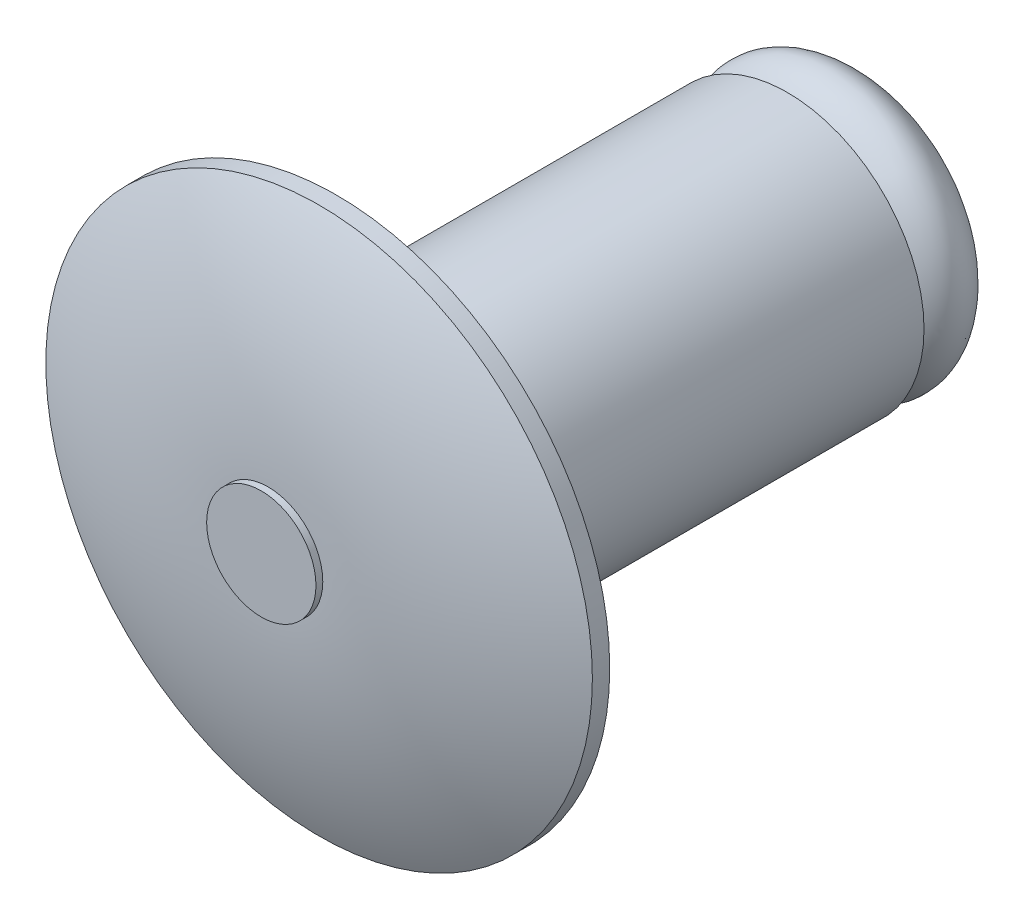
ISO-10303-21;
HEADER;
FILE_DESCRIPTION(('STEP AP214'),'2;1');
FILE_NAME('part.step','',(''),(''),'','','');
FILE_SCHEMA(('AUTOMOTIVE_DESIGN { 1 0 10303 214 1 1 1 1 }'));
ENDSEC;
DATA;
#1=APPLICATION_CONTEXT('core data for automotive mechanical design processes');
#2=APPLICATION_PROTOCOL_DEFINITION('international standard','automotive_design',2000,#1);
#3=PRODUCT_CONTEXT('',#1,'mechanical');
#4=PRODUCT('Part','Part','',(#3));
#5=PRODUCT_RELATED_PRODUCT_CATEGORY('part','',(#4));
#6=PRODUCT_DEFINITION_FORMATION('','',#4);
#7=PRODUCT_DEFINITION_CONTEXT('part definition',#1,'design');
#8=PRODUCT_DEFINITION('design','',#6,#7);
#9=PRODUCT_DEFINITION_SHAPE('','',#8);
#10=(LENGTH_UNIT() NAMED_UNIT(*) SI_UNIT(.MILLI.,.METRE.));
#11=(NAMED_UNIT(*) PLANE_ANGLE_UNIT() SI_UNIT($,.RADIAN.));
#12=(NAMED_UNIT(*) SI_UNIT($,.STERADIAN.) SOLID_ANGLE_UNIT());
#13=UNCERTAINTY_MEASURE_WITH_UNIT(LENGTH_MEASURE(1.E-05),#10,'distance_accuracy_value','');
#14=(GEOMETRIC_REPRESENTATION_CONTEXT(3) GLOBAL_UNCERTAINTY_ASSIGNED_CONTEXT((#13)) GLOBAL_UNIT_ASSIGNED_CONTEXT((#10,
#11,#12)) REPRESENTATION_CONTEXT('',''));
#15=CARTESIAN_POINT('',(0.,0.,0.));
#16=DIRECTION('',(0.,0.,1.));
#17=DIRECTION('',(1.,0.,0.));
#18=AXIS2_PLACEMENT_3D('',#15,#16,#17);
#19=CARTESIAN_POINT('',(0.,0.,-7.19716754070973));
#20=DIRECTION('',(1.,0.,0.));
#21=DIRECTION('',(0.,1.,0.));
#22=AXIS2_PLACEMENT_3D('',#19,#20,#21);
#23=ELLIPSE('',#22,2.,0.902832459290273);
#24=TRIMMED_CURVE('',#23,(PARAMETER_VALUE(4.71238898038469)),
(PARAMETER_VALUE(7.85398163397448)),.T.,.PARAMETER.);
#25=CARTESIAN_POINT('',(0.,0.,10.9));
#26=DIRECTION('',(0.,0.,1.));
#27=AXIS1_PLACEMENT('',#25,#26);
#28=SURFACE_OF_REVOLUTION('',#24,#27);
#29=CARTESIAN_POINT('',(0.,0.,-6.6));
#30=DIRECTION('',(0.,0.,1.));
#31=DIRECTION('',(1.,0.,0.));
#32=AXIS2_PLACEMENT_3D('',#29,#30,#31);
#33=CIRCLE('',#32,1.5);
#34=CARTESIAN_POINT('',(1.5,0.,-6.6));
#35=VERTEX_POINT('',#34);
#36=EDGE_CURVE('E77',#35,#35,#33,.T.);
#37=ORIENTED_EDGE('',*,*,#36,.F.);
#38=EDGE_LOOP('',(#37));
#39=FACE_BOUND('',#38,.T.);
#40=CARTESIAN_POINT('',(0.,0.,-8.1));
#41=VERTEX_POINT('',#40);
#42=VERTEX_LOOP('',#41);
#43=FACE_BOUND('',#42,.T.);
#44=ADVANCED_FACE('F40',(#39,#43),#28,.T.);
#45=CARTESIAN_POINT('',(0.,2.,-6.6));
#46=DIRECTION('',(0.,0.,1.));
#47=DIRECTION('',(1.,0.,0.));
#48=AXIS2_PLACEMENT_3D('',#45,#46,#47);
#49=PLANE('',#48);
#50=CARTESIAN_POINT('',(0.,0.,-6.6));
#51=DIRECTION('',(0.,0.,1.));
#52=DIRECTION('',(1.,0.,0.));
#53=AXIS2_PLACEMENT_3D('',#50,#51,#52);
#54=CIRCLE('',#53,2.);
#55=CARTESIAN_POINT('',(2.,0.,-6.6));
#56=VERTEX_POINT('',#55);
#57=EDGE_CURVE('E74',#56,#56,#54,.T.);
#58=ORIENTED_EDGE('',*,*,#57,.F.);
#59=EDGE_LOOP('',(#58));
#60=FACE_BOUND('',#59,.T.);
#61=ORIENTED_EDGE('',*,*,#36,.T.);
#62=EDGE_LOOP('',(#61));
#63=FACE_BOUND('',#62,.T.);
#64=ADVANCED_FACE('F52',(#60,#63),#49,.F.);
#65=CARTESIAN_POINT('',(0.,0.,10.9));
#66=DIRECTION('',(0.,0.,1.));
#67=DIRECTION('',(1.,0.,0.));
#68=AXIS2_PLACEMENT_3D('',#65,#66,#67);
#69=CYLINDRICAL_SURFACE('',#68,2.);
#70=CARTESIAN_POINT('',(0.,0.,-0.254000000000001));
#71=DIRECTION('',(0.,0.,1.));
#72=DIRECTION('',(1.,0.,0.));
#73=AXIS2_PLACEMENT_3D('',#70,#71,#72);
#74=CIRCLE('',#73,2.);
#75=CARTESIAN_POINT('',(2.,0.,-0.254000000000001));
#76=VERTEX_POINT('',#75);
#77=EDGE_CURVE('E11',#76,#76,#74,.F.);
#78=ORIENTED_EDGE('',*,*,#77,.T.);
#79=EDGE_LOOP('',(#78));
#80=FACE_BOUND('',#79,.T.);
#81=ORIENTED_EDGE('',*,*,#57,.T.);
#82=EDGE_LOOP('',(#81));
#83=FACE_BOUND('',#82,.T.);
#84=ADVANCED_FACE('F57',(#80,#83),#69,.T.);
#85=CARTESIAN_POINT('',(0.,2.,0.));
#86=DIRECTION('',(0.,0.,1.));
#87=DIRECTION('',(1.,0.,0.));
#88=AXIS2_PLACEMENT_3D('',#85,#86,#87);
#89=PLANE('',#88);
#90=CARTESIAN_POINT('',(0.,0.,0.));
#91=DIRECTION('',(0.,0.,1.));
#92=DIRECTION('',(1.,0.,0.));
#93=AXIS2_PLACEMENT_3D('',#90,#91,#92);
#94=CIRCLE('',#93,2.254);
#95=CARTESIAN_POINT('',(2.254,0.,0.));
#96=VERTEX_POINT('',#95);
#97=EDGE_CURVE('E48',#96,#96,#94,.T.);
#98=ORIENTED_EDGE('',*,*,#97,.T.);
#99=EDGE_LOOP('',(#98));
#100=FACE_BOUND('',#99,.T.);
#101=CARTESIAN_POINT('',(0.,0.,0.));
#102=DIRECTION('',(0.,0.,1.));
#103=DIRECTION('',(1.,0.,0.));
#104=AXIS2_PLACEMENT_3D('',#101,#102,#103);
#105=CIRCLE('',#104,4.);
#106=CARTESIAN_POINT('',(4.,0.,0.));
#107=VERTEX_POINT('',#106);
#108=EDGE_CURVE('E71',#107,#107,#105,.T.);
#109=ORIENTED_EDGE('',*,*,#108,.F.);
#110=EDGE_LOOP('',(#109));
#111=FACE_BOUND('',#110,.T.);
#112=ADVANCED_FACE('F83',(#100,#111),#89,.F.);
#113=CARTESIAN_POINT('',(0.,0.,10.9));
#114=DIRECTION('',(0.,0.,1.));
#115=DIRECTION('',(1.,0.,0.));
#116=AXIS2_PLACEMENT_3D('',#113,#114,#115);
#117=CYLINDRICAL_SURFACE('',#116,4.);
#118=CARTESIAN_POINT('',(0.,0.,0.253999999999999));
#119=DIRECTION('',(0.,0.,1.));
#120=DIRECTION('',(1.,0.,0.));
#121=AXIS2_PLACEMENT_3D('',#118,#119,#120);
#122=CIRCLE('',#121,4.);
#123=CARTESIAN_POINT('',(4.,0.,0.253999999999999));
#124=VERTEX_POINT('',#123);
#125=EDGE_CURVE('E68',#124,#124,#122,.T.);
#126=ORIENTED_EDGE('',*,*,#125,.F.);
#127=EDGE_LOOP('',(#126));
#128=FACE_BOUND('',#127,.T.);
#129=ORIENTED_EDGE('',*,*,#108,.T.);
#130=EDGE_LOOP('',(#129));
#131=FACE_BOUND('',#130,.T.);
#132=ADVANCED_FACE('F108',(#128,#131),#117,.T.);
#133=CARTESIAN_POINT('',(0.,0.,-6.23627077747988));
#134=DIRECTION('',(0.,0.,1.));
#135=DIRECTION('',(1.,0.,0.));
#136=AXIS2_PLACEMENT_3D('',#133,#134,#135);
#137=DEGENERATE_TOROIDAL_SURFACE('',#136,0.8,7.23627077747988,.T.);
#138=CARTESIAN_POINT('',(0.,0.,0.999999999999999));
#139=DIRECTION('',(0.,0.,1.));
#140=DIRECTION('',(1.,0.,0.));
#141=AXIS2_PLACEMENT_3D('',#138,#139,#140);
#142=CIRCLE('',#141,0.8);
#143=CARTESIAN_POINT('',(0.8,0.,0.999999999999999));
#144=VERTEX_POINT('',#143);
#145=EDGE_CURVE('E65',#144,#144,#142,.T.);
#146=ORIENTED_EDGE('',*,*,#145,.F.);
#147=EDGE_LOOP('',(#146));
#148=FACE_BOUND('',#147,.T.);
#149=ORIENTED_EDGE('',*,*,#125,.T.);
#150=EDGE_LOOP('',(#149));
#151=FACE_BOUND('',#150,.T.);
#152=ADVANCED_FACE('F96',(#148,#151),#137,.T.);
#153=CARTESIAN_POINT('',(0.,0.,10.9));
#154=DIRECTION('',(0.,0.,1.));
#155=DIRECTION('',(1.,0.,0.));
#156=AXIS2_PLACEMENT_3D('',#153,#154,#155);
#157=CYLINDRICAL_SURFACE('',#156,0.8);
#158=CARTESIAN_POINT('',(0.,0.,1.1));
#159=DIRECTION('',(0.,0.,-1.));
#160=DIRECTION('',(-1.,0.,0.));
#161=AXIS2_PLACEMENT_3D('',#158,#159,#160);
#162=CIRCLE('',#161,0.8);
#163=CARTESIAN_POINT('',(-0.8,0.,1.1));
#164=VERTEX_POINT('',#163);
#165=EDGE_CURVE('E44',#164,#164,#162,.T.);
#166=ORIENTED_EDGE('',*,*,#165,.T.);
#167=EDGE_LOOP('',(#166));
#168=FACE_BOUND('',#167,.T.);
#169=ORIENTED_EDGE('',*,*,#145,.T.);
#170=EDGE_LOOP('',(#169));
#171=FACE_BOUND('',#170,.T.);
#172=ADVANCED_FACE('F88',(#168,#171),#157,.T.);
#173=CARTESIAN_POINT('',(0.,0.,-0.254000000000001));
#174=DIRECTION('',(0.,0.,1.));
#175=DIRECTION('',(1.,0.,0.));
#176=AXIS2_PLACEMENT_3D('',#173,#174,#175);
#177=TOROIDAL_SURFACE('',#176,2.254,0.254);
#178=ORIENTED_EDGE('',*,*,#77,.F.);
#179=EDGE_LOOP('',(#178));
#180=FACE_BOUND('',#179,.T.);
#181=ORIENTED_EDGE('',*,*,#97,.F.);
#182=EDGE_LOOP('',(#181));
#183=FACE_BOUND('',#182,.T.);
#184=ADVANCED_FACE('F42',(#180,#183),#177,.F.);
#185=CARTESIAN_POINT('',(0.,0.,1.1));
#186=DIRECTION('',(0.,0.,-1.));
#187=DIRECTION('',(-1.,0.,0.));
#188=AXIS2_PLACEMENT_3D('',#185,#186,#187);
#189=PLANE('',#188);
#190=ORIENTED_EDGE('',*,*,#165,.F.);
#191=EDGE_LOOP('',(#190));
#192=FACE_BOUND('',#191,.T.);
#193=ADVANCED_FACE('F87',(#192),#189,.F.);
#194=CLOSED_SHELL('',(#44,#64,#84,#112,#132,#152,#172,#184,#193));
#195=MANIFOLD_SOLID_BREP('B2',#194);
#196=ADVANCED_BREP_SHAPE_REPRESENTATION('',(#18,#195),#14);
#197=SHAPE_DEFINITION_REPRESENTATION(#9,#196);
ENDSEC;
END-ISO-10303-21;
